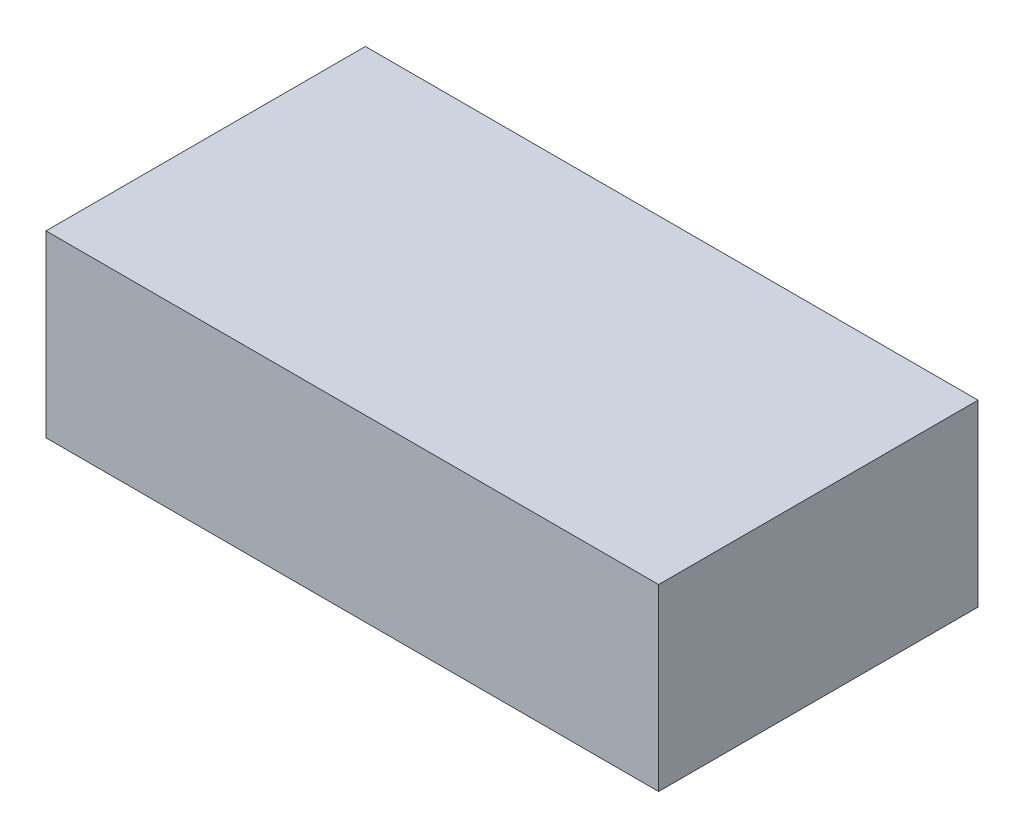
ISO-10303-21;
HEADER;
FILE_DESCRIPTION(('STEP AP214'),'2;1');
FILE_NAME('part.step','',(''),(''),'','','');
FILE_SCHEMA(('AUTOMOTIVE_DESIGN { 1 0 10303 214 1 1 1 1 }'));
ENDSEC;
DATA;
#1=APPLICATION_CONTEXT('core data for automotive mechanical design processes');
#2=APPLICATION_PROTOCOL_DEFINITION('international standard','automotive_design',2000,#1);
#3=PRODUCT_CONTEXT('',#1,'mechanical');
#4=PRODUCT('Part','Part','',(#3));
#5=PRODUCT_RELATED_PRODUCT_CATEGORY('part','',(#4));
#6=PRODUCT_DEFINITION_FORMATION('','',#4);
#7=PRODUCT_DEFINITION_CONTEXT('part definition',#1,'design');
#8=PRODUCT_DEFINITION('design','',#6,#7);
#9=PRODUCT_DEFINITION_SHAPE('','',#8);
#10=(LENGTH_UNIT() NAMED_UNIT(*) SI_UNIT(.MILLI.,.METRE.));
#11=(NAMED_UNIT(*) PLANE_ANGLE_UNIT() SI_UNIT($,.RADIAN.));
#12=(NAMED_UNIT(*) SI_UNIT($,.STERADIAN.) SOLID_ANGLE_UNIT());
#13=UNCERTAINTY_MEASURE_WITH_UNIT(LENGTH_MEASURE(1.E-05),#10,'distance_accuracy_value','');
#14=(GEOMETRIC_REPRESENTATION_CONTEXT(3) GLOBAL_UNCERTAINTY_ASSIGNED_CONTEXT((#13)) GLOBAL_UNIT_ASSIGNED_CONTEXT((#10,
#11,#12)) REPRESENTATION_CONTEXT('',''));
#15=CARTESIAN_POINT('',(0.,0.,0.));
#16=DIRECTION('',(0.,0.,1.));
#17=DIRECTION('',(1.,0.,0.));
#18=AXIS2_PLACEMENT_3D('',#15,#16,#17);
#19=CARTESIAN_POINT('',(111.25,-32.55,116.));
#20=DIRECTION('',(-1.,0.,0.));
#21=DIRECTION('',(0.,0.,1.));
#22=AXIS2_PLACEMENT_3D('',#19,#20,#21);
#23=PLANE('',#22);
#24=DIRECTION('',(0.,1.,0.));
#25=VECTOR('',#24,1.);
#26=CARTESIAN_POINT('',(111.25,-32.55,0.));
#27=LINE('',#26,#25);
#28=CARTESIAN_POINT('',(111.25,-32.55,0.));
#29=VERTEX_POINT('',#28);
#30=CARTESIAN_POINT('',(111.25,32.55,0.));
#31=VERTEX_POINT('',#30);
#32=EDGE_CURVE('E104',#29,#31,#27,.T.);
#33=ORIENTED_EDGE('',*,*,#32,.T.);
#34=DIRECTION('',(0.,0.,-1.));
#35=VECTOR('',#34,1.);
#36=CARTESIAN_POINT('',(111.25,32.55,116.));
#37=LINE('',#36,#35);
#38=CARTESIAN_POINT('',(111.25,32.55,116.));
#39=VERTEX_POINT('',#38);
#40=EDGE_CURVE('E11',#39,#31,#37,.T.);
#41=ORIENTED_EDGE('',*,*,#40,.F.);
#42=DIRECTION('',(0.,1.,0.));
#43=VECTOR('',#42,1.);
#44=CARTESIAN_POINT('',(111.25,-32.55,116.));
#45=LINE('',#44,#43);
#46=CARTESIAN_POINT('',(111.25,-32.55,116.));
#47=VERTEX_POINT('',#46);
#48=EDGE_CURVE('E90',#47,#39,#45,.T.);
#49=ORIENTED_EDGE('',*,*,#48,.F.);
#50=DIRECTION('',(0.,0.,-1.));
#51=VECTOR('',#50,1.);
#52=CARTESIAN_POINT('',(111.25,-32.55,116.));
#53=LINE('',#52,#51);
#54=EDGE_CURVE('E57',#47,#29,#53,.T.);
#55=ORIENTED_EDGE('',*,*,#54,.T.);
#56=EDGE_LOOP('',(#33,#41,#49,#55));
#57=FACE_BOUND('',#56,.T.);
#58=ADVANCED_FACE('F41',(#57),#23,.F.);
#59=CARTESIAN_POINT('',(111.25,32.55,116.));
#60=DIRECTION('',(0.,-1.,0.));
#61=DIRECTION('',(0.,0.,-1.));
#62=AXIS2_PLACEMENT_3D('',#59,#60,#61);
#63=PLANE('',#62);
#64=DIRECTION('',(-1.,0.,0.));
#65=VECTOR('',#64,1.);
#66=CARTESIAN_POINT('',(111.25,32.55,0.));
#67=LINE('',#66,#65);
#68=CARTESIAN_POINT('',(-111.25,32.55,0.));
#69=VERTEX_POINT('',#68);
#70=EDGE_CURVE('E95',#31,#69,#67,.T.);
#71=ORIENTED_EDGE('',*,*,#70,.T.);
#72=DIRECTION('',(0.,0.,-1.));
#73=VECTOR('',#72,1.);
#74=CARTESIAN_POINT('',(-111.25,32.55,116.));
#75=LINE('',#74,#73);
#76=CARTESIAN_POINT('',(-111.25,32.55,116.));
#77=VERTEX_POINT('',#76);
#78=EDGE_CURVE('E49',#77,#69,#75,.T.);
#79=ORIENTED_EDGE('',*,*,#78,.F.);
#80=DIRECTION('',(-1.,0.,0.));
#81=VECTOR('',#80,1.);
#82=CARTESIAN_POINT('',(111.25,32.55,116.));
#83=LINE('',#82,#81);
#84=EDGE_CURVE('E82',#39,#77,#83,.T.);
#85=ORIENTED_EDGE('',*,*,#84,.F.);
#86=ORIENTED_EDGE('',*,*,#40,.T.);
#87=EDGE_LOOP('',(#71,#79,#85,#86));
#88=FACE_BOUND('',#87,.T.);
#89=ADVANCED_FACE('F94',(#88),#63,.F.);
#90=CARTESIAN_POINT('',(-111.25,-32.55,116.));
#91=DIRECTION('',(-1.,0.,0.));
#92=DIRECTION('',(0.,0.,1.));
#93=AXIS2_PLACEMENT_3D('',#90,#91,#92);
#94=PLANE('',#93);
#95=DIRECTION('',(0.,1.,0.));
#96=VECTOR('',#95,1.);
#97=CARTESIAN_POINT('',(-111.25,-32.55,0.));
#98=LINE('',#97,#96);
#99=CARTESIAN_POINT('',(-111.25,-32.55,0.));
#100=VERTEX_POINT('',#99);
#101=EDGE_CURVE('E108',#100,#69,#98,.T.);
#102=ORIENTED_EDGE('',*,*,#101,.F.);
#103=DIRECTION('',(0.,0.,-1.));
#104=VECTOR('',#103,1.);
#105=CARTESIAN_POINT('',(-111.25,-32.55,116.));
#106=LINE('',#105,#104);
#107=CARTESIAN_POINT('',(-111.25,-32.55,116.));
#108=VERTEX_POINT('',#107);
#109=EDGE_CURVE('E71',#108,#100,#106,.T.);
#110=ORIENTED_EDGE('',*,*,#109,.F.);
#111=DIRECTION('',(0.,1.,0.));
#112=VECTOR('',#111,1.);
#113=CARTESIAN_POINT('',(-111.25,-32.55,116.));
#114=LINE('',#113,#112);
#115=EDGE_CURVE('E89',#108,#77,#114,.T.);
#116=ORIENTED_EDGE('',*,*,#115,.T.);
#117=ORIENTED_EDGE('',*,*,#78,.T.);
#118=EDGE_LOOP('',(#102,#110,#116,#117));
#119=FACE_BOUND('',#118,.T.);
#120=ADVANCED_FACE('F98',(#119),#94,.T.);
#121=CARTESIAN_POINT('',(111.25,-32.55,116.));
#122=DIRECTION('',(0.,-1.,0.));
#123=DIRECTION('',(1.,0.,0.));
#124=AXIS2_PLACEMENT_3D('',#121,#122,#123);
#125=PLANE('',#124);
#126=DIRECTION('',(-1.,0.,0.));
#127=VECTOR('',#126,1.);
#128=CARTESIAN_POINT('',(111.25,-32.55,0.));
#129=LINE('',#128,#127);
#130=EDGE_CURVE('E110',#29,#100,#129,.T.);
#131=ORIENTED_EDGE('',*,*,#130,.F.);
#132=ORIENTED_EDGE('',*,*,#54,.F.);
#133=DIRECTION('',(-1.,0.,0.));
#134=VECTOR('',#133,1.);
#135=CARTESIAN_POINT('',(111.25,-32.55,116.));
#136=LINE('',#135,#134);
#137=EDGE_CURVE('E99',#47,#108,#136,.T.);
#138=ORIENTED_EDGE('',*,*,#137,.T.);
#139=ORIENTED_EDGE('',*,*,#109,.T.);
#140=EDGE_LOOP('',(#131,#132,#138,#139));
#141=FACE_BOUND('',#140,.T.);
#142=ADVANCED_FACE('F117',(#141),#125,.T.);
#143=CARTESIAN_POINT('',(0.,0.,116.));
#144=DIRECTION('',(0.,0.,1.));
#145=DIRECTION('',(1.,0.,0.));
#146=AXIS2_PLACEMENT_3D('',#143,#144,#145);
#147=PLANE('',#146);
#148=ORIENTED_EDGE('',*,*,#48,.T.);
#149=ORIENTED_EDGE('',*,*,#84,.T.);
#150=ORIENTED_EDGE('',*,*,#115,.F.);
#151=ORIENTED_EDGE('',*,*,#137,.F.);
#152=EDGE_LOOP('',(#148,#149,#150,#151));
#153=FACE_BOUND('',#152,.T.);
#154=ADVANCED_FACE('F86',(#153),#147,.T.);
#155=CARTESIAN_POINT('',(0.,0.,0.));
#156=DIRECTION('',(0.,0.,1.));
#157=DIRECTION('',(1.,0.,0.));
#158=AXIS2_PLACEMENT_3D('',#155,#156,#157);
#159=PLANE('',#158);
#160=ORIENTED_EDGE('',*,*,#32,.F.);
#161=ORIENTED_EDGE('',*,*,#130,.T.);
#162=ORIENTED_EDGE('',*,*,#101,.T.);
#163=ORIENTED_EDGE('',*,*,#70,.F.);
#164=EDGE_LOOP('',(#160,#161,#162,#163));
#165=FACE_BOUND('',#164,.T.);
#166=ADVANCED_FACE('F116',(#165),#159,.F.);
#167=CLOSED_SHELL('',(#58,#89,#120,#142,#154,#166));
#168=MANIFOLD_SOLID_BREP('B2',#167);
#169=ADVANCED_BREP_SHAPE_REPRESENTATION('',(#18,#168),#14);
#170=SHAPE_DEFINITION_REPRESENTATION(#9,#169);
ENDSEC;
END-ISO-10303-21;
